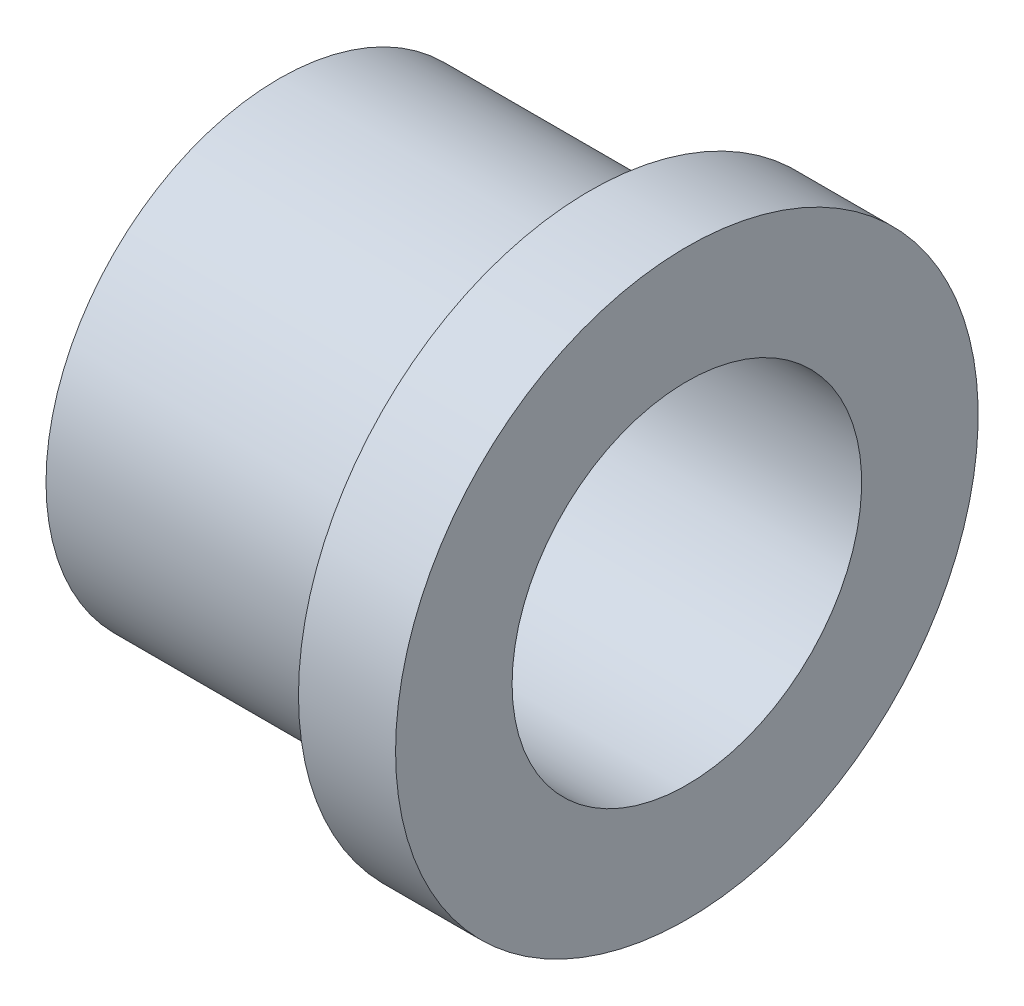
ISO-10303-21;
HEADER;
FILE_DESCRIPTION(('STEP AP214'),'2;1');
FILE_NAME('part.step','',(''),(''),'','','');
FILE_SCHEMA(('AUTOMOTIVE_DESIGN { 1 0 10303 214 1 1 1 1 }'));
ENDSEC;
DATA;
#1=APPLICATION_CONTEXT('core data for automotive mechanical design processes');
#2=APPLICATION_PROTOCOL_DEFINITION('international standard','automotive_design',2000,#1);
#3=PRODUCT_CONTEXT('',#1,'mechanical');
#4=PRODUCT('Part','Part','',(#3));
#5=PRODUCT_RELATED_PRODUCT_CATEGORY('part','',(#4));
#6=PRODUCT_DEFINITION_FORMATION('','',#4);
#7=PRODUCT_DEFINITION_CONTEXT('part definition',#1,'design');
#8=PRODUCT_DEFINITION('design','',#6,#7);
#9=PRODUCT_DEFINITION_SHAPE('','',#8);
#10=(LENGTH_UNIT() NAMED_UNIT(*) SI_UNIT(.MILLI.,.METRE.));
#11=(NAMED_UNIT(*) PLANE_ANGLE_UNIT() SI_UNIT($,.RADIAN.));
#12=(NAMED_UNIT(*) SI_UNIT($,.STERADIAN.) SOLID_ANGLE_UNIT());
#13=UNCERTAINTY_MEASURE_WITH_UNIT(LENGTH_MEASURE(1.E-05),#10,'distance_accuracy_value','');
#14=(GEOMETRIC_REPRESENTATION_CONTEXT(3) GLOBAL_UNCERTAINTY_ASSIGNED_CONTEXT((#13)) GLOBAL_UNIT_ASSIGNED_CONTEXT((#10,
#11,#12)) REPRESENTATION_CONTEXT('',''));
#15=CARTESIAN_POINT('',(0.,0.,0.));
#16=DIRECTION('',(0.,0.,1.));
#17=DIRECTION('',(1.,0.,0.));
#18=AXIS2_PLACEMENT_3D('',#15,#16,#17);
#19=CARTESIAN_POINT('',(0.,0.,-12.));
#20=DIRECTION('',(1.,0.,0.));
#21=DIRECTION('',(0.,0.,-1.));
#22=AXIS2_PLACEMENT_3D('',#19,#20,#21);
#23=PLANE('',#22);
#24=CARTESIAN_POINT('',(0.,0.,0.));
#25=DIRECTION('',(-1.,0.,0.));
#26=DIRECTION('',(0.,0.,1.));
#27=AXIS2_PLACEMENT_3D('',#24,#25,#26);
#28=CIRCLE('',#27,9.);
#29=CARTESIAN_POINT('',(0.,0.,9.));
#30=VERTEX_POINT('',#29);
#31=EDGE_CURVE('E10',#30,#30,#28,.T.);
#32=ORIENTED_EDGE('',*,*,#31,.F.);
#33=EDGE_LOOP('',(#32));
#34=FACE_BOUND('',#33,.T.);
#35=CARTESIAN_POINT('',(0.,0.,0.));
#36=DIRECTION('',(-1.,0.,0.));
#37=DIRECTION('',(0.,0.,1.));
#38=AXIS2_PLACEMENT_3D('',#35,#36,#37);
#39=CIRCLE('',#38,12.);
#40=CARTESIAN_POINT('',(0.,0.,12.));
#41=VERTEX_POINT('',#40);
#42=EDGE_CURVE('E57',#41,#41,#39,.T.);
#43=ORIENTED_EDGE('',*,*,#42,.T.);
#44=EDGE_LOOP('',(#43));
#45=FACE_BOUND('',#44,.T.);
#46=ADVANCED_FACE('F35',(#34,#45),#23,.F.);
#47=CARTESIAN_POINT('',(0.,0.,0.));
#48=DIRECTION('',(-1.,0.,0.));
#49=DIRECTION('',(0.,0.,1.));
#50=AXIS2_PLACEMENT_3D('',#47,#48,#49);
#51=CYLINDRICAL_SURFACE('',#50,9.);
#52=CARTESIAN_POINT('',(21.,0.,0.));
#53=DIRECTION('',(-1.,0.,0.));
#54=DIRECTION('',(0.,0.,1.));
#55=AXIS2_PLACEMENT_3D('',#52,#53,#54);
#56=CIRCLE('',#55,9.);
#57=CARTESIAN_POINT('',(21.,0.,9.));
#58=VERTEX_POINT('',#57);
#59=EDGE_CURVE('E41',#58,#58,#56,.T.);
#60=ORIENTED_EDGE('',*,*,#59,.F.);
#61=EDGE_LOOP('',(#60));
#62=FACE_BOUND('',#61,.T.);
#63=ORIENTED_EDGE('',*,*,#31,.T.);
#64=EDGE_LOOP('',(#63));
#65=FACE_BOUND('',#64,.T.);
#66=ADVANCED_FACE('F82',(#62,#65),#51,.F.);
#67=CARTESIAN_POINT('',(21.,0.,-15.));
#68=DIRECTION('',(-1.,0.,0.));
#69=DIRECTION('',(0.,0.,1.));
#70=AXIS2_PLACEMENT_3D('',#67,#68,#69);
#71=PLANE('',#70);
#72=CARTESIAN_POINT('',(21.,0.,0.));
#73=DIRECTION('',(-1.,0.,0.));
#74=DIRECTION('',(0.,0.,1.));
#75=AXIS2_PLACEMENT_3D('',#72,#73,#74);
#76=CIRCLE('',#75,15.);
#77=CARTESIAN_POINT('',(21.,0.,15.));
#78=VERTEX_POINT('',#77);
#79=EDGE_CURVE('E45',#78,#78,#76,.T.);
#80=ORIENTED_EDGE('',*,*,#79,.F.);
#81=EDGE_LOOP('',(#80));
#82=FACE_BOUND('',#81,.T.);
#83=ORIENTED_EDGE('',*,*,#59,.T.);
#84=EDGE_LOOP('',(#83));
#85=FACE_BOUND('',#84,.T.);
#86=ADVANCED_FACE('F77',(#82,#85),#71,.F.);
#87=CARTESIAN_POINT('',(0.,0.,0.));
#88=DIRECTION('',(-1.,0.,0.));
#89=DIRECTION('',(0.,0.,1.));
#90=AXIS2_PLACEMENT_3D('',#87,#88,#89);
#91=CYLINDRICAL_SURFACE('',#90,15.);
#92=CARTESIAN_POINT('',(16.,0.,0.));
#93=DIRECTION('',(-1.,0.,0.));
#94=DIRECTION('',(0.,0.,1.));
#95=AXIS2_PLACEMENT_3D('',#92,#93,#94);
#96=CIRCLE('',#95,15.);
#97=CARTESIAN_POINT('',(16.,0.,15.));
#98=VERTEX_POINT('',#97);
#99=EDGE_CURVE('E49',#98,#98,#96,.T.);
#100=ORIENTED_EDGE('',*,*,#99,.F.);
#101=EDGE_LOOP('',(#100));
#102=FACE_BOUND('',#101,.T.);
#103=ORIENTED_EDGE('',*,*,#79,.T.);
#104=EDGE_LOOP('',(#103));
#105=FACE_BOUND('',#104,.T.);
#106=ADVANCED_FACE('F71',(#102,#105),#91,.T.);
#107=CARTESIAN_POINT('',(16.,0.,-12.));
#108=DIRECTION('',(1.,0.,0.));
#109=DIRECTION('',(0.,0.,-1.));
#110=AXIS2_PLACEMENT_3D('',#107,#108,#109);
#111=PLANE('',#110);
#112=CARTESIAN_POINT('',(16.,0.,0.));
#113=DIRECTION('',(-1.,0.,0.));
#114=DIRECTION('',(0.,0.,1.));
#115=AXIS2_PLACEMENT_3D('',#112,#113,#114);
#116=CIRCLE('',#115,12.);
#117=CARTESIAN_POINT('',(16.,0.,12.));
#118=VERTEX_POINT('',#117);
#119=EDGE_CURVE('E54',#118,#118,#116,.T.);
#120=ORIENTED_EDGE('',*,*,#119,.F.);
#121=EDGE_LOOP('',(#120));
#122=FACE_BOUND('',#121,.T.);
#123=ORIENTED_EDGE('',*,*,#99,.T.);
#124=EDGE_LOOP('',(#123));
#125=FACE_BOUND('',#124,.T.);
#126=ADVANCED_FACE('F65',(#122,#125),#111,.F.);
#127=CARTESIAN_POINT('',(0.,0.,0.));
#128=DIRECTION('',(-1.,0.,0.));
#129=DIRECTION('',(0.,0.,1.));
#130=AXIS2_PLACEMENT_3D('',#127,#128,#129);
#131=CYLINDRICAL_SURFACE('',#130,12.);
#132=ORIENTED_EDGE('',*,*,#42,.F.);
#133=EDGE_LOOP('',(#132));
#134=FACE_BOUND('',#133,.T.);
#135=ORIENTED_EDGE('',*,*,#119,.T.);
#136=EDGE_LOOP('',(#135));
#137=FACE_BOUND('',#136,.T.);
#138=ADVANCED_FACE('F62',(#134,#137),#131,.T.);
#139=CLOSED_SHELL('',(#46,#66,#86,#106,#126,#138));
#140=MANIFOLD_SOLID_BREP('B2',#139);
#141=ADVANCED_BREP_SHAPE_REPRESENTATION('',(#18,#140),#14);
#142=SHAPE_DEFINITION_REPRESENTATION(#9,#141);
ENDSEC;
END-ISO-10303-21;
